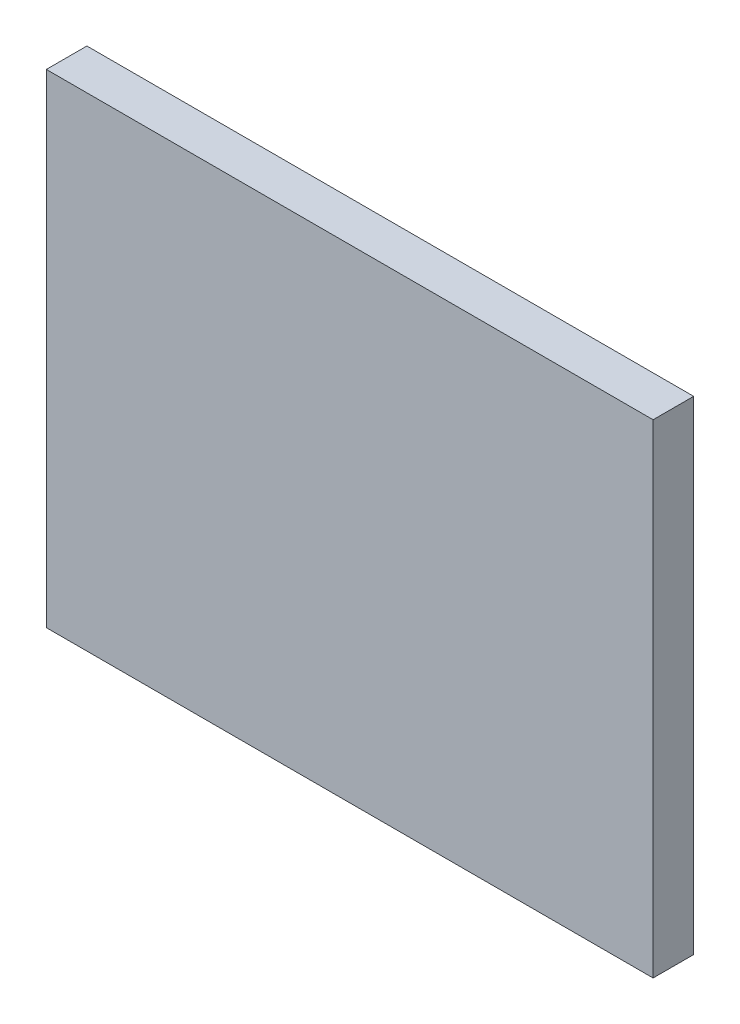
ISO-10303-21;
HEADER;
FILE_DESCRIPTION(('STEP AP214'),'2;1');
FILE_NAME('part.step','',(''),(''),'','','');
FILE_SCHEMA(('AUTOMOTIVE_DESIGN { 1 0 10303 214 1 1 1 1 }'));
ENDSEC;
DATA;
#1=APPLICATION_CONTEXT('core data for automotive mechanical design processes');
#2=APPLICATION_PROTOCOL_DEFINITION('international standard','automotive_design',2000,#1);
#3=PRODUCT_CONTEXT('',#1,'mechanical');
#4=PRODUCT('Part','Part','',(#3));
#5=PRODUCT_RELATED_PRODUCT_CATEGORY('part','',(#4));
#6=PRODUCT_DEFINITION_FORMATION('','',#4);
#7=PRODUCT_DEFINITION_CONTEXT('part definition',#1,'design');
#8=PRODUCT_DEFINITION('design','',#6,#7);
#9=PRODUCT_DEFINITION_SHAPE('','',#8);
#10=(LENGTH_UNIT() NAMED_UNIT(*) SI_UNIT(.MILLI.,.METRE.));
#11=(NAMED_UNIT(*) PLANE_ANGLE_UNIT() SI_UNIT($,.RADIAN.));
#12=(NAMED_UNIT(*) SI_UNIT($,.STERADIAN.) SOLID_ANGLE_UNIT());
#13=UNCERTAINTY_MEASURE_WITH_UNIT(LENGTH_MEASURE(1.E-05),#10,'distance_accuracy_value','');
#14=(GEOMETRIC_REPRESENTATION_CONTEXT(3) GLOBAL_UNCERTAINTY_ASSIGNED_CONTEXT((#13)) GLOBAL_UNIT_ASSIGNED_CONTEXT((#10,
#11,#12)) REPRESENTATION_CONTEXT('',''));
#15=CARTESIAN_POINT('',(0.,0.,0.));
#16=DIRECTION('',(0.,0.,1.));
#17=DIRECTION('',(1.,0.,0.));
#18=AXIS2_PLACEMENT_3D('',#15,#16,#17);
#19=CARTESIAN_POINT('',(23.749,18.923,3.175));
#20=DIRECTION('',(-1.,0.,0.));
#21=DIRECTION('',(0.,-1.,0.));
#22=AXIS2_PLACEMENT_3D('',#19,#20,#21);
#23=PLANE('',#22);
#24=DIRECTION('',(0.,1.,0.));
#25=VECTOR('',#24,1.);
#26=CARTESIAN_POINT('',(23.749,18.923,0.));
#27=LINE('',#26,#25);
#28=CARTESIAN_POINT('',(23.749,-18.923,0.));
#29=VERTEX_POINT('',#28);
#30=CARTESIAN_POINT('',(23.749,18.923,0.));
#31=VERTEX_POINT('',#30);
#32=EDGE_CURVE('E105',#29,#31,#27,.T.);
#33=ORIENTED_EDGE('',*,*,#32,.T.);
#34=DIRECTION('',(0.,0.,-1.));
#35=VECTOR('',#34,1.);
#36=CARTESIAN_POINT('',(23.749,18.923,3.175));
#37=LINE('',#36,#35);
#38=CARTESIAN_POINT('',(23.749,18.923,3.175));
#39=VERTEX_POINT('',#38);
#40=EDGE_CURVE('E11',#39,#31,#37,.T.);
#41=ORIENTED_EDGE('',*,*,#40,.F.);
#42=DIRECTION('',(0.,1.,0.));
#43=VECTOR('',#42,1.);
#44=CARTESIAN_POINT('',(23.749,18.923,3.175));
#45=LINE('',#44,#43);
#46=CARTESIAN_POINT('',(23.749,-18.923,3.175));
#47=VERTEX_POINT('',#46);
#48=EDGE_CURVE('E89',#47,#39,#45,.T.);
#49=ORIENTED_EDGE('',*,*,#48,.F.);
#50=DIRECTION('',(0.,0.,-1.));
#51=VECTOR('',#50,1.);
#52=CARTESIAN_POINT('',(23.749,-18.923,3.175));
#53=LINE('',#52,#51);
#54=EDGE_CURVE('E97',#47,#29,#53,.T.);
#55=ORIENTED_EDGE('',*,*,#54,.T.);
#56=EDGE_LOOP('',(#33,#41,#49,#55));
#57=FACE_BOUND('',#56,.T.);
#58=ADVANCED_FACE('F39',(#57),#23,.F.);
#59=CARTESIAN_POINT('',(-23.749,18.923,3.175));
#60=DIRECTION('',(0.,-1.,0.));
#61=DIRECTION('',(0.,0.,-1.));
#62=AXIS2_PLACEMENT_3D('',#59,#60,#61);
#63=PLANE('',#62);
#64=DIRECTION('',(-1.,0.,0.));
#65=VECTOR('',#64,1.);
#66=CARTESIAN_POINT('',(-23.749,18.923,0.));
#67=LINE('',#66,#65);
#68=CARTESIAN_POINT('',(-23.749,18.923,0.));
#69=VERTEX_POINT('',#68);
#70=EDGE_CURVE('E92',#31,#69,#67,.T.);
#71=ORIENTED_EDGE('',*,*,#70,.T.);
#72=DIRECTION('',(0.,0.,-1.));
#73=VECTOR('',#72,1.);
#74=CARTESIAN_POINT('',(-23.749,18.923,3.175));
#75=LINE('',#74,#73);
#76=CARTESIAN_POINT('',(-23.749,18.923,3.175));
#77=VERTEX_POINT('',#76);
#78=EDGE_CURVE('E50',#77,#69,#75,.T.);
#79=ORIENTED_EDGE('',*,*,#78,.F.);
#80=DIRECTION('',(-1.,0.,0.));
#81=VECTOR('',#80,1.);
#82=CARTESIAN_POINT('',(-23.749,18.923,3.175));
#83=LINE('',#82,#81);
#84=EDGE_CURVE('E82',#39,#77,#83,.T.);
#85=ORIENTED_EDGE('',*,*,#84,.F.);
#86=ORIENTED_EDGE('',*,*,#40,.T.);
#87=EDGE_LOOP('',(#71,#79,#85,#86));
#88=FACE_BOUND('',#87,.T.);
#89=ADVANCED_FACE('F93',(#88),#63,.F.);
#90=CARTESIAN_POINT('',(-23.749,18.923,3.175));
#91=DIRECTION('',(1.,0.,0.));
#92=DIRECTION('',(0.,1.,0.));
#93=AXIS2_PLACEMENT_3D('',#90,#91,#92);
#94=PLANE('',#93);
#95=DIRECTION('',(0.,-1.,0.));
#96=VECTOR('',#95,1.);
#97=CARTESIAN_POINT('',(-23.749,18.923,0.));
#98=LINE('',#97,#96);
#99=CARTESIAN_POINT('',(-23.749,-18.923,0.));
#100=VERTEX_POINT('',#99);
#101=EDGE_CURVE('E72',#69,#100,#98,.T.);
#102=ORIENTED_EDGE('',*,*,#101,.T.);
#103=DIRECTION('',(0.,0.,-1.));
#104=VECTOR('',#103,1.);
#105=CARTESIAN_POINT('',(-23.749,-18.923,3.175));
#106=LINE('',#105,#104);
#107=CARTESIAN_POINT('',(-23.749,-18.923,3.175));
#108=VERTEX_POINT('',#107);
#109=EDGE_CURVE('E94',#108,#100,#106,.T.);
#110=ORIENTED_EDGE('',*,*,#109,.F.);
#111=DIRECTION('',(0.,-1.,0.));
#112=VECTOR('',#111,1.);
#113=CARTESIAN_POINT('',(-23.749,18.923,3.175));
#114=LINE('',#113,#112);
#115=EDGE_CURVE('E88',#77,#108,#114,.T.);
#116=ORIENTED_EDGE('',*,*,#115,.F.);
#117=ORIENTED_EDGE('',*,*,#78,.T.);
#118=EDGE_LOOP('',(#102,#110,#116,#117));
#119=FACE_BOUND('',#118,.T.);
#120=ADVANCED_FACE('F96',(#119),#94,.F.);
#121=CARTESIAN_POINT('',(-23.749,-18.923,3.175));
#122=DIRECTION('',(0.,1.,0.));
#123=DIRECTION('',(0.,0.,1.));
#124=AXIS2_PLACEMENT_3D('',#121,#122,#123);
#125=PLANE('',#124);
#126=DIRECTION('',(1.,0.,0.));
#127=VECTOR('',#126,1.);
#128=CARTESIAN_POINT('',(-23.749,-18.923,0.));
#129=LINE('',#128,#127);
#130=EDGE_CURVE('E76',#100,#29,#129,.T.);
#131=ORIENTED_EDGE('',*,*,#130,.T.);
#132=ORIENTED_EDGE('',*,*,#54,.F.);
#133=DIRECTION('',(1.,0.,0.));
#134=VECTOR('',#133,1.);
#135=CARTESIAN_POINT('',(-23.749,-18.923,3.175));
#136=LINE('',#135,#134);
#137=EDGE_CURVE('E54',#108,#47,#136,.T.);
#138=ORIENTED_EDGE('',*,*,#137,.F.);
#139=ORIENTED_EDGE('',*,*,#109,.T.);
#140=EDGE_LOOP('',(#131,#132,#138,#139));
#141=FACE_BOUND('',#140,.T.);
#142=ADVANCED_FACE('F108',(#141),#125,.F.);
#143=CARTESIAN_POINT('',(0.,0.,3.175));
#144=DIRECTION('',(0.,0.,1.));
#145=DIRECTION('',(1.,0.,0.));
#146=AXIS2_PLACEMENT_3D('',#143,#144,#145);
#147=PLANE('',#146);
#148=ORIENTED_EDGE('',*,*,#48,.T.);
#149=ORIENTED_EDGE('',*,*,#84,.T.);
#150=ORIENTED_EDGE('',*,*,#115,.T.);
#151=ORIENTED_EDGE('',*,*,#137,.T.);
#152=EDGE_LOOP('',(#148,#149,#150,#151));
#153=FACE_BOUND('',#152,.T.);
#154=ADVANCED_FACE('F86',(#153),#147,.T.);
#155=CARTESIAN_POINT('',(0.,0.,0.));
#156=DIRECTION('',(0.,0.,1.));
#157=DIRECTION('',(1.,0.,0.));
#158=AXIS2_PLACEMENT_3D('',#155,#156,#157);
#159=PLANE('',#158);
#160=ORIENTED_EDGE('',*,*,#32,.F.);
#161=ORIENTED_EDGE('',*,*,#130,.F.);
#162=ORIENTED_EDGE('',*,*,#101,.F.);
#163=ORIENTED_EDGE('',*,*,#70,.F.);
#164=EDGE_LOOP('',(#160,#161,#162,#163));
#165=FACE_BOUND('',#164,.T.);
#166=ADVANCED_FACE('F115',(#165),#159,.F.);
#167=CLOSED_SHELL('',(#58,#89,#120,#142,#154,#166));
#168=MANIFOLD_SOLID_BREP('B2',#167);
#169=ADVANCED_BREP_SHAPE_REPRESENTATION('',(#18,#168),#14);
#170=SHAPE_DEFINITION_REPRESENTATION(#9,#169);
ENDSEC;
END-ISO-10303-21;
